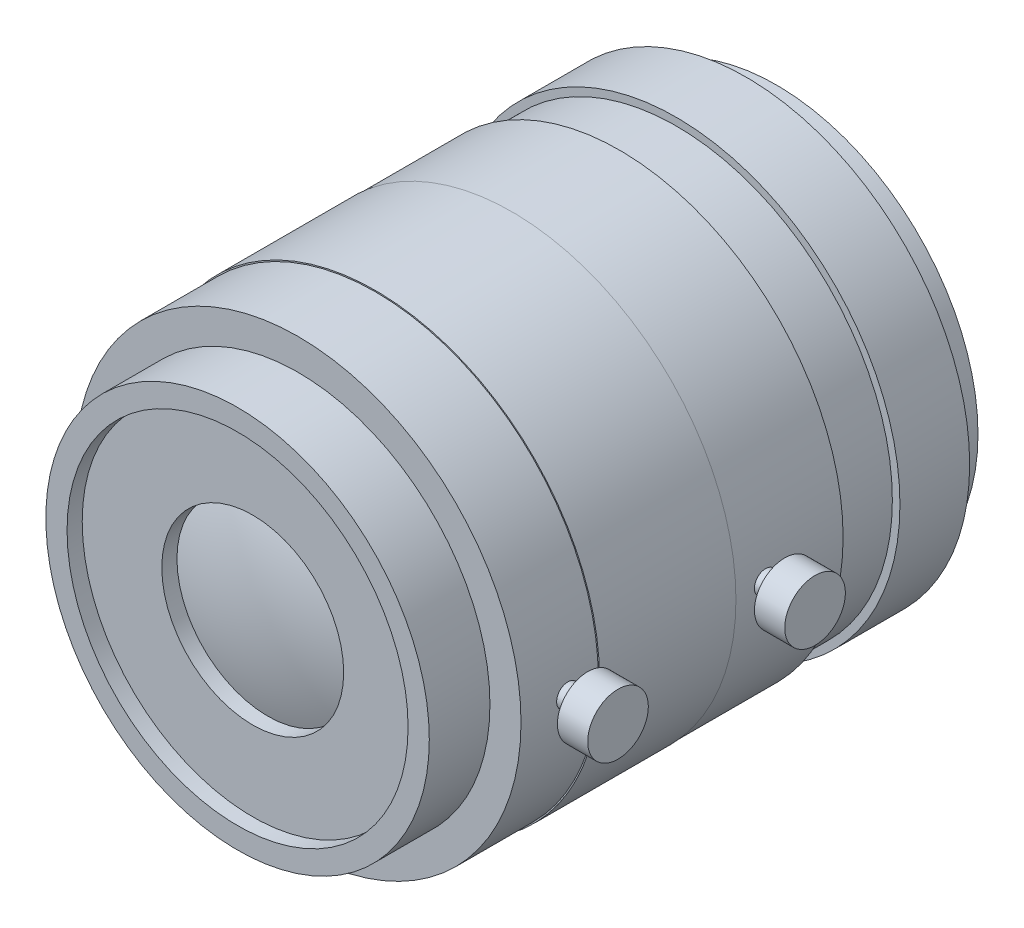
ISO-10303-21;
HEADER;
FILE_DESCRIPTION(('STEP AP214'),'2;1');
FILE_NAME('part.step','',(''),(''),'','','');
FILE_SCHEMA(('AUTOMOTIVE_DESIGN { 1 0 10303 214 1 1 1 1 }'));
ENDSEC;
DATA;
#1=APPLICATION_CONTEXT('core data for automotive mechanical design processes');
#2=APPLICATION_PROTOCOL_DEFINITION('international standard','automotive_design',2000,#1);
#3=PRODUCT_CONTEXT('',#1,'mechanical');
#4=PRODUCT('Part','Part','',(#3));
#5=PRODUCT_RELATED_PRODUCT_CATEGORY('part','',(#4));
#6=PRODUCT_DEFINITION_FORMATION('','',#4);
#7=PRODUCT_DEFINITION_CONTEXT('part definition',#1,'design');
#8=PRODUCT_DEFINITION('design','',#6,#7);
#9=PRODUCT_DEFINITION_SHAPE('','',#8);
#10=(LENGTH_UNIT() NAMED_UNIT(*) SI_UNIT(.MILLI.,.METRE.));
#11=(NAMED_UNIT(*) PLANE_ANGLE_UNIT() SI_UNIT($,.RADIAN.));
#12=(NAMED_UNIT(*) SI_UNIT($,.STERADIAN.) SOLID_ANGLE_UNIT());
#13=UNCERTAINTY_MEASURE_WITH_UNIT(LENGTH_MEASURE(1.E-05),#10,'distance_accuracy_value','');
#14=(GEOMETRIC_REPRESENTATION_CONTEXT(3) GLOBAL_UNCERTAINTY_ASSIGNED_CONTEXT((#13)) GLOBAL_UNIT_ASSIGNED_CONTEXT((#10,
#11,#12)) REPRESENTATION_CONTEXT('',''));
#15=CARTESIAN_POINT('',(0.,0.,0.));
#16=DIRECTION('',(0.,0.,1.));
#17=DIRECTION('',(1.,0.,0.));
#18=AXIS2_PLACEMENT_3D('',#15,#16,#17);
#19=CARTESIAN_POINT('',(0.,0.,17.45));
#20=DIRECTION('',(0.,0.,-1.));
#21=DIRECTION('',(-1.,0.,0.));
#22=AXIS2_PLACEMENT_3D('',#19,#20,#21);
#23=CYLINDRICAL_SURFACE('',#22,14.75);
#24=CARTESIAN_POINT('',(0.,0.,10.35));
#25=DIRECTION('',(0.,0.,1.));
#26=DIRECTION('',(1.,0.,0.));
#27=AXIS2_PLACEMENT_3D('',#24,#25,#26);
#28=CIRCLE('',#27,14.75);
#29=CARTESIAN_POINT('',(14.75,0.,10.35));
#30=VERTEX_POINT('',#29);
#31=EDGE_CURVE('E204',#30,#30,#28,.T.);
#32=ORIENTED_EDGE('',*,*,#31,.T.);
#33=EDGE_LOOP('',(#32));
#34=FACE_BOUND('',#33,.T.);
#35=CARTESIAN_POINT('',(0.,0.,17.45));
#36=DIRECTION('',(0.,0.,1.));
#37=DIRECTION('',(1.,0.,0.));
#38=AXIS2_PLACEMENT_3D('',#35,#36,#37);
#39=CIRCLE('',#38,14.75);
#40=CARTESIAN_POINT('',(14.75,0.,17.45));
#41=VERTEX_POINT('',#40);
#42=EDGE_CURVE('E201',#41,#41,#39,.T.);
#43=ORIENTED_EDGE('',*,*,#42,.F.);
#44=EDGE_LOOP('',(#43));
#45=FACE_BOUND('',#44,.T.);
#46=CARTESIAN_POINT('',(14.75,0.,16.2));
#47=CARTESIAN_POINT('',(14.7499997449926,-0.0420986424959198,16.1999981423904));
#48=CARTESIAN_POINT('',(14.7498178364062,-0.084227117100974,16.1964435033522));
#49=CARTESIAN_POINT('',(14.7491096549743,-0.167321824963212,16.1823137913616));
#50=CARTESIAN_POINT('',(14.7485829766985,-0.208286630559902,16.1717304528306));
#51=CARTESIAN_POINT('',(14.7472448652268,-0.287838272752351,16.1438471965999));
#52=CARTESIAN_POINT('',(14.7464335774809,-0.326426312178121,16.1265507091839));
#53=CARTESIAN_POINT('',(14.7446176101786,-0.400140853303471,16.0857374276205));
#54=CARTESIAN_POINT('',(14.7436129762068,-0.4352681679826,16.0622220991834));
#55=CARTESIAN_POINT('',(14.7415221582976,-0.501111084497214,16.0096114627243));
#56=CARTESIAN_POINT('',(14.7404359009587,-0.531822641295692,15.9805110947987));
#57=CARTESIAN_POINT('',(14.7383048966012,-0.587927774020349,15.9175665612008));
#58=CARTESIAN_POINT('',(14.737260151282,-0.613321132410172,15.8837222015741));
#59=CARTESIAN_POINT('',(14.7353294597504,-0.658080307671017,15.8122290397837));
#60=CARTESIAN_POINT('',(14.7344435973103,-0.677442948737445,15.7745782469103));
#61=CARTESIAN_POINT('',(14.7329314670159,-0.709570685076601,15.6965549946493));
#62=CARTESIAN_POINT('',(14.732305197142,-0.722335831681388,15.6561825564403));
#63=CARTESIAN_POINT('',(14.731383541628,-0.740895490880794,15.573899400099));
#64=CARTESIAN_POINT('',(14.7310878675586,-0.746696080050412,15.5319900558718));
#65=CARTESIAN_POINT('',(14.730859880457,-0.751180716000307,15.4477915450975));
#66=CARTESIAN_POINT('',(14.7309275644816,-0.749864820424926,15.4055023816298));
#67=CARTESIAN_POINT('',(14.7314183928722,-0.740158900928861,15.3217859763418));
#68=CARTESIAN_POINT('',(14.7318412072995,-0.731775443197582,15.2803579710477));
#69=CARTESIAN_POINT('',(14.7329941219114,-0.708182550981223,15.1994980357776));
#70=CARTESIAN_POINT('',(14.7337242234275,-0.692973086917101,15.1600661144522));
#71=CARTESIAN_POINT('',(14.7354098043382,-0.656152426913122,15.0842965251642));
#72=CARTESIAN_POINT('',(14.7363653890495,-0.63453823830094,15.0479603139455));
#73=CARTESIAN_POINT('',(14.7383941262876,-0.585523856324031,14.9794295295357));
#74=CARTESIAN_POINT('',(14.739467279674,-0.558123620652883,14.9472349866305));
#75=CARTESIAN_POINT('',(14.7416116668489,-0.498277886896576,14.8878632070561));
#76=CARTESIAN_POINT('',(14.7426828970807,-0.465826702891609,14.8606917012371));
#77=CARTESIAN_POINT('',(14.7447015288594,-0.396820222387124,14.812181458413));
#78=CARTESIAN_POINT('',(14.7456489303752,-0.360264924855566,14.7908427228748));
#79=CARTESIAN_POINT('',(14.7473131755578,-0.284084528389697,14.7546042947347));
#80=CARTESIAN_POINT('',(14.748030012027,-0.244459333668455,14.7397048031457));
#81=CARTESIAN_POINT('',(14.749152234801,-0.163265448064132,14.7167715557727));
#82=CARTESIAN_POINT('',(14.7495576235168,-0.121696772228012,14.7087377468419));
#83=CARTESIAN_POINT('',(14.750010953271,-0.0378456564079585,14.6997709807508));
#84=CARTESIAN_POINT('',(14.7500592933224,0.00443593387173076,14.6988300970024));
#85=CARTESIAN_POINT('',(14.7497941372842,0.0885563923737214,14.7040552022283));
#86=CARTESIAN_POINT('',(14.7494806424329,0.130395262110677,14.7102211668803));
#87=CARTESIAN_POINT('',(14.7485273821002,0.212420408484705,14.7294783789475));
#88=CARTESIAN_POINT('',(14.7478877871895,0.252607537222658,14.7425660060328));
#89=CARTESIAN_POINT('',(14.7463543331718,0.330214687753501,14.7752913623716));
#90=CARTESIAN_POINT('',(14.7454604725507,0.367634693067773,14.7949291306284));
#91=CARTESIAN_POINT('',(14.7435180408848,0.438681769962589,14.8402176119385));
#92=CARTESIAN_POINT('',(14.7424693334623,0.472305451480879,14.8658736372753));
#93=CARTESIAN_POINT('',(14.7403357627123,0.534771339123963,14.9224625925922));
#94=CARTESIAN_POINT('',(14.7392508991454,0.563613513578834,14.9533955575209));
#95=CARTESIAN_POINT('',(14.7371661522128,0.615724359464938,15.0196944238398));
#96=CARTESIAN_POINT('',(14.7361663475975,0.638987901484963,15.0550643597537));
#97=CARTESIAN_POINT('',(14.7343657011286,0.679246056150842,15.1292127658487));
#98=CARTESIAN_POINT('',(14.7335648583869,0.696240696776054,15.1679912208159));
#99=CARTESIAN_POINT('',(14.7322530058265,0.72346969332499,15.2478368999242));
#100=CARTESIAN_POINT('',(14.7317418559385,0.733707316723624,15.288903007397));
#101=CARTESIAN_POINT('',(14.7310666362807,0.747142356162024,15.3721738955304));
#102=CARTESIAN_POINT('',(14.7309025644511,0.75033981398336,15.4143786694318));
#103=CARTESIAN_POINT('',(14.730940053912,0.749603361923809,15.4986777958917));
#104=CARTESIAN_POINT('',(14.7311412014928,0.745677521106673,15.5407722193658));
#105=CARTESIAN_POINT('',(14.7318855848103,0.730822594702965,15.6237035035544));
#106=CARTESIAN_POINT('',(14.7324288211972,0.719893495804319,15.6645403618783));
#107=CARTESIAN_POINT('',(14.7337960620359,0.691343950804935,15.7437989630694));
#108=CARTESIAN_POINT('',(14.7346200683477,0.673723460377368,15.7822206899357));
#109=CARTESIAN_POINT('',(14.7364559527303,0.632292681526358,15.855561010223));
#110=CARTESIAN_POINT('',(14.7374678250912,0.608482581217104,15.890479710063));
#111=CARTESIAN_POINT('',(14.7395667060197,0.55531948458365,15.9558631208749));
#112=CARTESIAN_POINT('',(14.7406537903698,0.525960844517172,15.9863232402913));
#113=CARTESIAN_POINT('',(14.7427800291808,0.462538122176354,16.0418920728538));
#114=CARTESIAN_POINT('',(14.7438191717886,0.428472884478458,16.0669994680979));
#115=CARTESIAN_POINT('',(14.7457331727311,0.356576489379588,16.1111622915394));
#116=CARTESIAN_POINT('',(14.7466078699096,0.31874169278726,16.1302117955264));
#117=CARTESIAN_POINT('',(14.748092024838,0.240434606912813,16.1616653085616));
#118=CARTESIAN_POINT('',(14.7487017955551,0.19996549501561,16.174077162934));
#119=CARTESIAN_POINT('',(14.7494261963092,0.132704316154791,16.1886491975148));
#120=CARTESIAN_POINT('',(14.7496404263979,0.10634785878314,16.1929003098998));
#121=CARTESIAN_POINT('',(14.7499274089613,0.0533315922115218,16.1985762983411));
#122=CARTESIAN_POINT('',(14.7500001615611,0.026671783279859,16.2000011768969));
#123=CARTESIAN_POINT('',(14.75,0.,16.2));
#124=B_SPLINE_CURVE_WITH_KNOTS('',3,(#46,#47,#48,#49,#50,#51,#52,#53,#54,#55,#56,#57,#58,#59,
#60,#61,#62,#63,#64,#65,#66,#67,#68,#69,#70,#71,#72,#73,#74,#75,#76,#77,#78,#79,#80,#81,#82,#83,
#84,#85,#86,#87,#88,#89,#90,#91,#92,#93,#94,#95,#96,#97,#98,#99,#100,#101,#102,#103,#104,#105,
#106,#107,#108,#109,#110,#111,#112,#113,#114,#115,#116,#117,#118,#119,#120,#121,#122,#123),
.UNSPECIFIED.,.T.,.F.,(4,2,2,2,2,2,2,2,2,2,2,2,2,2,2,2,2,2,2,2,2,2,2,2,2,2,2,2,2,2,2,2,2,2,2,2,
2,2,4),(0.,0.126198565172506,0.252545800175523,0.378828559107524,0.505081581108117,
0.631449529730949,0.757822646317467,0.884262199511887,1.01070076892368,1.13702894035567,
1.26335608851653,1.38956600035197,1.51577645909641,1.64204598419815,1.76831643258942,
1.89473006730384,2.02114373380692,2.14756134625897,2.27397798011353,2.40025331805718,
2.52652822384252,2.65273714759442,2.77894682287817,2.90526832478777,3.03159066334414,
3.15802871051865,3.28446619336811,3.41084249025872,3.53721803713655,3.66345051886287,
3.78968324053764,3.91591679845009,4.04214652032955,4.16850533564246,4.29489522610437,
4.42140833997611,4.54777159020003,4.62772532642028,4.70767899192949),.UNSPECIFIED.);
#125=CARTESIAN_POINT('',(14.75,0.,16.2));
#126=VERTEX_POINT('',#125);
#127=EDGE_CURVE('E12',#126,#126,#124,.T.);
#128=ORIENTED_EDGE('',*,*,#127,.F.);
#129=EDGE_LOOP('',(#128));
#130=FACE_BOUND('',#129,.T.);
#131=ADVANCED_FACE('F47',(#34,#45,#130),#23,.T.);
#132=CARTESIAN_POINT('',(0.,0.,31.55));
#133=DIRECTION('',(0.,0.,-1.));
#134=DIRECTION('',(-1.,0.,0.));
#135=AXIS2_PLACEMENT_3D('',#132,#133,#134);
#136=CYLINDRICAL_SURFACE('',#135,14.7);
#137=CARTESIAN_POINT('',(0.,0.,26.45));
#138=DIRECTION('',(0.,0.,1.));
#139=DIRECTION('',(1.,0.,0.));
#140=AXIS2_PLACEMENT_3D('',#137,#138,#139);
#141=CIRCLE('',#140,14.7);
#142=CARTESIAN_POINT('',(14.7,0.,26.45));
#143=VERTEX_POINT('',#142);
#144=EDGE_CURVE('E215',#143,#143,#141,.T.);
#145=ORIENTED_EDGE('',*,*,#144,.T.);
#146=EDGE_LOOP('',(#145));
#147=FACE_BOUND('',#146,.T.);
#148=CARTESIAN_POINT('',(0.,0.,31.55));
#149=DIRECTION('',(0.,0.,1.));
#150=DIRECTION('',(1.,0.,0.));
#151=AXIS2_PLACEMENT_3D('',#148,#149,#150);
#152=CIRCLE('',#151,14.7);
#153=CARTESIAN_POINT('',(14.7,0.,31.55));
#154=VERTEX_POINT('',#153);
#155=EDGE_CURVE('E212',#154,#154,#152,.T.);
#156=ORIENTED_EDGE('',*,*,#155,.F.);
#157=EDGE_LOOP('',(#156));
#158=FACE_BOUND('',#157,.T.);
#159=CARTESIAN_POINT('',(14.7,0.,29.2));
#160=CARTESIAN_POINT('',(14.6999997441453,-0.0420984438103649,29.199998142467));
#161=CARTESIAN_POINT('',(14.6998172185627,-0.0842267148579676,29.196443536846));
#162=CARTESIAN_POINT('',(14.6991066351314,-0.167321007592917,29.1823139653331));
#163=CARTESIAN_POINT('',(14.6985781705394,-0.208285601837116,29.1717307352082));
#164=CARTESIAN_POINT('',(14.6972355202302,-0.287836820295201,29.1438477838122));
#165=CARTESIAN_POINT('',(14.6964214805207,-0.326424647863005,29.1265514942868));
#166=CARTESIAN_POINT('',(14.6945993514444,-0.400138807112249,29.0857386968858));
#167=CARTESIAN_POINT('',(14.6935913078001,-0.435265951459357,29.0622236541499));
#168=CARTESIAN_POINT('',(14.6914933842579,-0.501108783927412,29.0096135172327));
#169=CARTESIAN_POINT('',(14.6904034302626,-0.53182040273414,28.9805133327577));
#170=CARTESIAN_POINT('',(14.6882651688393,-0.58792570530152,28.9175691555892));
#171=CARTESIAN_POINT('',(14.6872168631168,-0.613319171466295,28.8837249688861));
#172=CARTESIAN_POINT('',(14.6852795828221,-0.658078695254236,28.8122319803044));
#173=CARTESIAN_POINT('',(14.6843906929015,-0.67744155455485,28.7745811735639));
#174=CARTESIAN_POINT('',(14.6828733906333,-0.709569710715836,28.6965578200381));
#175=CARTESIAN_POINT('',(14.6822449762488,-0.722335059169346,28.6561852945397));
#176=CARTESIAN_POINT('',(14.6813201635029,-0.740895025948526,28.5739021474881));
#177=CARTESIAN_POINT('',(14.6810234737566,-0.74669576227874,28.5319929092528));
#178=CARTESIAN_POINT('',(14.6807946928025,-0.751180720237949,28.4477945780107));
#179=CARTESIAN_POINT('',(14.6808625986258,-0.749864999816994,28.4055054881));
#180=CARTESIAN_POINT('',(14.6813550803598,-0.74015948752035,28.3217894782599));
#181=CARTESIAN_POINT('',(14.6817793229438,-0.731776306705254,28.2803617896528));
#182=CARTESIAN_POINT('',(14.682936137401,-0.708184087019952,28.1995024412166));
#183=CARTESIAN_POINT('',(14.6836687106172,-0.692975018419736,28.1600707900821));
#184=CARTESIAN_POINT('',(14.6853600039263,-0.656155206128501,28.0843015430107));
#185=CARTESIAN_POINT('',(14.6863188304115,-0.634541449501558,28.0479654136709));
#186=CARTESIAN_POINT('',(14.6883544539516,-0.585527990576816,27.9794347001342));
#187=CARTESIAN_POINT('',(14.6894312518753,-0.558128245669378,27.9472401464398));
#188=CARTESIAN_POINT('',(14.6915829353735,-0.498283286326846,27.8878679917553));
#189=CARTESIAN_POINT('',(14.6926578173612,-0.465832347166053,27.8606961606138));
#190=CARTESIAN_POINT('',(14.6946833365665,-0.396826277978345,27.8121852239036));
#191=CARTESIAN_POINT('',(14.6956339737527,-0.360271146914672,27.7908461198083));
#192=CARTESIAN_POINT('',(14.6973039102817,-0.284090975802565,27.754606924635));
#193=CARTESIAN_POINT('',(14.6980232023454,-0.244465839208952,27.7397070361539));
#194=CARTESIAN_POINT('',(14.6991492786587,-0.163271971542928,27.7167730028883));
#195=CARTESIAN_POINT('',(14.6995560653437,-0.121703255620309,27.7087388045967));
#196=CARTESIAN_POINT('',(14.7000109727551,-0.0378523005895708,27.6997713272799));
#197=CARTESIAN_POINT('',(14.7000594965732,0.00442908295278208,27.698830067767));
#198=CARTESIAN_POINT('',(14.6997934799421,0.0885491902826168,27.7040543586362));
#199=CARTESIAN_POINT('',(14.6994789407441,0.130387915595033,27.7102198845279));
#200=CARTESIAN_POINT('',(14.6985224836092,0.212412687004607,27.7294761240632));
#201=CARTESIAN_POINT('',(14.6978807379989,0.252599591024187,27.7425631925382));
#202=CARTESIAN_POINT('',(14.6963421159234,0.330206392450413,27.7752873272584));
#203=CARTESIAN_POINT('',(14.6954452379286,0.367626273265975,27.7949244327738));
#204=CARTESIAN_POINT('',(14.6934962326078,0.438673451302916,27.840211639536));
#205=CARTESIAN_POINT('',(14.692443967508,0.47229733564046,27.865867088945));
#206=CARTESIAN_POINT('',(14.6903031468177,0.534763743328181,27.9224549076625));
#207=CARTESIAN_POINT('',(14.6892145909853,0.563606234804575,27.9533873121454));
#208=CARTESIAN_POINT('',(14.6871227291205,0.615718003813322,28.019685321942));
#209=CARTESIAN_POINT('',(14.6861195026362,0.63898211688308,28.0550549894923));
#210=CARTESIAN_POINT('',(14.6843126807449,0.679241446655533,28.1292029923673));
#211=CARTESIAN_POINT('',(14.6835090844423,0.696236691480942,28.1679813123995));
#212=CARTESIAN_POINT('',(14.6821927094462,0.72346685192606,28.2478267326175));
#213=CARTESIAN_POINT('',(14.6816797892709,0.733705056820931,28.2888927086165));
#214=CARTESIAN_POINT('',(14.6810022095042,0.747141269332584,28.3721634521285));
#215=CARTESIAN_POINT('',(14.6808375478273,0.750339319104398,28.4143682128211));
#216=CARTESIAN_POINT('',(14.6808751051641,0.749604040930043,28.4986670837402));
#217=CARTESIAN_POINT('',(14.6810769062248,0.74567883709727,28.5407612652558));
#218=CARTESIAN_POINT('',(14.6818237614719,0.730825271050774,28.6236921684938));
#219=CARTESIAN_POINT('',(14.6823688163103,0.719896895532444,28.6645288878271));
#220=CARTESIAN_POINT('',(14.6837406530963,0.691348877113216,28.7437873220169));
#221=CARTESIAN_POINT('',(14.684567436868,0.673729190889461,28.7822090212354));
#222=CARTESIAN_POINT('',(14.6864095224091,0.632300081631089,28.8555494347117));
#223=CARTESIAN_POINT('',(14.6874248184603,0.60849084633696,28.8904682551737));
#224=CARTESIAN_POINT('',(14.6895308213232,0.555329300782933,28.955852339137));
#225=CARTESIAN_POINT('',(14.6906216047574,0.525971304427291,28.986312976792));
#226=CARTESIAN_POINT('',(14.6927550914892,0.462549775495414,29.0418829612071));
#227=CARTESIAN_POINT('',(14.6937977828975,0.428485087552976,29.0669909901858));
#228=CARTESIAN_POINT('',(14.6957183383228,0.356589533167721,29.1111552624439));
#229=CARTESIAN_POINT('',(14.6965960400731,0.318755014471391,29.130205560566));
#230=CARTESIAN_POINT('',(14.6980853098261,0.240448305672302,29.1616606879543));
#231=CARTESIAN_POINT('',(14.6986971918182,0.19997929282332,29.1740733616836));
#232=CARTESIAN_POINT('',(14.6994241435057,0.132715936932388,29.1886471945144));
#233=CARTESIAN_POINT('',(14.6996391398769,0.106357206840218,29.1928990561948));
#234=CARTESIAN_POINT('',(14.6999271491173,0.053336309192895,29.1985760461576));
#235=CARTESIAN_POINT('',(14.700000162113,0.0266741419080756,29.200001176958));
#236=CARTESIAN_POINT('',(14.7,0.,29.2));
#237=B_SPLINE_CURVE_WITH_KNOTS('',3,(#159,#160,#161,#162,#163,#164,#165,#166,#167,#168,#169,
#170,#171,#172,#173,#174,#175,#176,#177,#178,#179,#180,#181,#182,#183,#184,#185,#186,#187,#188,
#189,#190,#191,#192,#193,#194,#195,#196,#197,#198,#199,#200,#201,#202,#203,#204,#205,#206,#207,
#208,#209,#210,#211,#212,#213,#214,#215,#216,#217,#218,#219,#220,#221,#222,#223,#224,#225,#226,
#227,#228,#229,#230,#231,#232,#233,#234,#235,#236),.UNSPECIFIED.,.T.,.F.,(4,2,2,2,2,2,2,2,2,2,2,
2,2,2,2,2,2,2,2,2,2,2,2,2,2,2,2,2,2,2,2,2,2,2,2,2,2,2,4),(0.,0.126197960433093,
0.252544567325209,0.378826670163499,0.505079047375356,0.631447042052803,0.757820206154049,
0.88426027837824,1.01069936181455,1.13702729445477,1.26335419839501,1.3895630642709,
1.51577247985216,1.64204136221737,1.76831117449446,1.89472514972898,2.02113915689693,
2.14755714113292,2.27397414013161,2.40024888213515,2.52652318898721,2.65273106072385,
2.77893968914208,2.90526089976477,3.03158295243768,3.15802150639141,3.28445949312338,
3.41083588532728,3.53721152081273,3.66344311470057,3.78967494840356,3.91590759940786,
4.04213642198869,4.16849530592659,4.29488526286164,4.42139888087347,4.54776265052589,
4.62772345190401,4.70768418205038),.UNSPECIFIED.);
#238=CARTESIAN_POINT('',(14.7,0.,29.2));
#239=VERTEX_POINT('',#238);
#240=EDGE_CURVE('E59',#239,#239,#237,.T.);
#241=ORIENTED_EDGE('',*,*,#240,.F.);
#242=EDGE_LOOP('',(#241));
#243=FACE_BOUND('',#242,.T.);
#244=ADVANCED_FACE('F77',(#147,#158,#243),#136,.T.);
#245=CARTESIAN_POINT('',(0.,0.,31.55));
#246=DIRECTION('',(0.,0.,1.));
#247=DIRECTION('',(1.,0.,0.));
#248=AXIS2_PLACEMENT_3D('',#245,#246,#247);
#249=PLANE('',#248);
#250=ORIENTED_EDGE('',*,*,#155,.T.);
#251=EDGE_LOOP('',(#250));
#252=FACE_BOUND('',#251,.T.);
#253=CARTESIAN_POINT('',(0.,0.,31.55));
#254=DIRECTION('',(0.,0.,1.));
#255=DIRECTION('',(1.,0.,0.));
#256=AXIS2_PLACEMENT_3D('',#253,#254,#255);
#257=CIRCLE('',#256,12.65);
#258=CARTESIAN_POINT('',(12.65,0.,31.55));
#259=VERTEX_POINT('',#258);
#260=EDGE_CURVE('E220',#259,#259,#257,.T.);
#261=ORIENTED_EDGE('',*,*,#260,.F.);
#262=EDGE_LOOP('',(#261));
#263=FACE_BOUND('',#262,.T.);
#264=ADVANCED_FACE('F114',(#252,#263),#249,.T.);
#265=CARTESIAN_POINT('',(0.,0.,26.45));
#266=DIRECTION('',(0.,0.,1.));
#267=DIRECTION('',(1.,0.,0.));
#268=AXIS2_PLACEMENT_3D('',#265,#266,#267);
#269=PLANE('',#268);
#270=CARTESIAN_POINT('',(0.,0.,26.45));
#271=DIRECTION('',(0.,0.,1.));
#272=DIRECTION('',(1.,0.,0.));
#273=AXIS2_PLACEMENT_3D('',#270,#271,#272);
#274=CIRCLE('',#273,14.78);
#275=CARTESIAN_POINT('',(14.78,0.,26.45));
#276=VERTEX_POINT('',#275);
#277=EDGE_CURVE('E206',#276,#276,#274,.T.);
#278=ORIENTED_EDGE('',*,*,#277,.T.);
#279=EDGE_LOOP('',(#278));
#280=FACE_BOUND('',#279,.T.);
#281=ORIENTED_EDGE('',*,*,#144,.F.);
#282=EDGE_LOOP('',(#281));
#283=FACE_BOUND('',#282,.T.);
#284=ADVANCED_FACE('F116',(#280,#283),#269,.T.);
#285=CARTESIAN_POINT('',(0.,0.,6.6));
#286=DIRECTION('',(0.,0.,1.));
#287=DIRECTION('',(1.,0.,0.));
#288=AXIS2_PLACEMENT_3D('',#285,#286,#287);
#289=PLANE('',#288);
#290=CARTESIAN_POINT('',(0.,0.,6.6));
#291=DIRECTION('',(0.,0.,1.));
#292=DIRECTION('',(1.,0.,0.));
#293=AXIS2_PLACEMENT_3D('',#290,#291,#292);
#294=CIRCLE('',#293,14.75);
#295=CARTESIAN_POINT('',(14.75,0.,6.6));
#296=VERTEX_POINT('',#295);
#297=EDGE_CURVE('E188',#296,#296,#294,.T.);
#298=ORIENTED_EDGE('',*,*,#297,.T.);
#299=EDGE_LOOP('',(#298));
#300=FACE_BOUND('',#299,.T.);
#301=CARTESIAN_POINT('',(0.,0.,6.6));
#302=DIRECTION('',(0.,0.,1.));
#303=DIRECTION('',(1.,0.,0.));
#304=AXIS2_PLACEMENT_3D('',#301,#302,#303);
#305=CIRCLE('',#304,14.25);
#306=CARTESIAN_POINT('',(14.25,0.,6.6));
#307=VERTEX_POINT('',#306);
#308=EDGE_CURVE('E198',#307,#307,#305,.T.);
#309=ORIENTED_EDGE('',*,*,#308,.F.);
#310=EDGE_LOOP('',(#309));
#311=FACE_BOUND('',#310,.T.);
#312=ADVANCED_FACE('F122',(#300,#311),#289,.T.);
#313=CARTESIAN_POINT('',(0.,0.,0.));
#314=DIRECTION('',(0.,0.,1.));
#315=DIRECTION('',(1.,0.,0.));
#316=AXIS2_PLACEMENT_3D('',#313,#314,#315);
#317=PLANE('',#316);
#318=CARTESIAN_POINT('',(0.,0.,0.));
#319=DIRECTION('',(0.,0.,1.));
#320=DIRECTION('',(1.,0.,0.));
#321=AXIS2_PLACEMENT_3D('',#318,#319,#320);
#322=CIRCLE('',#321,13.3);
#323=CARTESIAN_POINT('',(13.3,0.,0.));
#324=VERTEX_POINT('',#323);
#325=EDGE_CURVE('E67',#324,#324,#322,.T.);
#326=ORIENTED_EDGE('',*,*,#325,.F.);
#327=EDGE_LOOP('',(#326));
#328=FACE_BOUND('',#327,.T.);
#329=CARTESIAN_POINT('',(0.,0.,0.));
#330=DIRECTION('',(0.,0.,1.));
#331=DIRECTION('',(1.,0.,0.));
#332=AXIS2_PLACEMENT_3D('',#329,#330,#331);
#333=CIRCLE('',#332,12.5);
#334=CARTESIAN_POINT('',(12.5,0.,0.));
#335=VERTEX_POINT('',#334);
#336=EDGE_CURVE('E184',#335,#335,#333,.T.);
#337=ORIENTED_EDGE('',*,*,#336,.T.);
#338=EDGE_LOOP('',(#337));
#339=FACE_BOUND('',#338,.T.);
#340=ADVANCED_FACE('F149',(#328,#339),#317,.F.);
#341=CARTESIAN_POINT('',(0.,0.,2.));
#342=DIRECTION('',(0.,0.,-1.));
#343=DIRECTION('',(-1.,0.,0.));
#344=AXIS2_PLACEMENT_3D('',#341,#342,#343);
#345=CYLINDRICAL_SURFACE('',#344,13.3);
#346=CARTESIAN_POINT('',(0.,0.,2.));
#347=DIRECTION('',(0.,0.,1.));
#348=DIRECTION('',(1.,0.,0.));
#349=AXIS2_PLACEMENT_3D('',#346,#347,#348);
#350=CIRCLE('',#349,13.3);
#351=CARTESIAN_POINT('',(13.3,0.,2.));
#352=VERTEX_POINT('',#351);
#353=EDGE_CURVE('E63',#352,#352,#350,.T.);
#354=ORIENTED_EDGE('',*,*,#353,.F.);
#355=EDGE_LOOP('',(#354));
#356=FACE_BOUND('',#355,.T.);
#357=ORIENTED_EDGE('',*,*,#325,.T.);
#358=EDGE_LOOP('',(#357));
#359=FACE_BOUND('',#358,.T.);
#360=ADVANCED_FACE('F161',(#356,#359),#345,.T.);
#361=CARTESIAN_POINT('',(0.,0.,2.));
#362=DIRECTION('',(0.,0.,-1.));
#363=DIRECTION('',(-1.,0.,0.));
#364=AXIS2_PLACEMENT_3D('',#361,#362,#363);
#365=CYLINDRICAL_SURFACE('',#364,12.5);
#366=ORIENTED_EDGE('',*,*,#336,.F.);
#367=EDGE_LOOP('',(#366));
#368=FACE_BOUND('',#367,.T.);
#369=CARTESIAN_POINT('',(0.,0.,6.6));
#370=DIRECTION('',(0.,0.,1.));
#371=DIRECTION('',(1.,0.,0.));
#372=AXIS2_PLACEMENT_3D('',#369,#370,#371);
#373=CIRCLE('',#372,12.5);
#374=CARTESIAN_POINT('',(12.5,0.,6.6));
#375=VERTEX_POINT('',#374);
#376=EDGE_CURVE('E192',#375,#375,#373,.T.);
#377=ORIENTED_EDGE('',*,*,#376,.T.);
#378=EDGE_LOOP('',(#377));
#379=FACE_BOUND('',#378,.T.);
#380=ADVANCED_FACE('F154',(#368,#379),#365,.F.);
#381=CARTESIAN_POINT('',(0.,0.,2.));
#382=DIRECTION('',(0.,0.,1.));
#383=DIRECTION('',(1.,0.,0.));
#384=AXIS2_PLACEMENT_3D('',#381,#382,#383);
#385=PLANE('',#384);
#386=CARTESIAN_POINT('',(0.,0.,2.));
#387=DIRECTION('',(0.,0.,1.));
#388=DIRECTION('',(1.,0.,0.));
#389=AXIS2_PLACEMENT_3D('',#386,#387,#388);
#390=CIRCLE('',#389,14.75);
#391=CARTESIAN_POINT('',(14.75,0.,2.));
#392=VERTEX_POINT('',#391);
#393=EDGE_CURVE('E189',#392,#392,#390,.T.);
#394=ORIENTED_EDGE('',*,*,#393,.F.);
#395=EDGE_LOOP('',(#394));
#396=FACE_BOUND('',#395,.T.);
#397=ORIENTED_EDGE('',*,*,#353,.T.);
#398=EDGE_LOOP('',(#397));
#399=FACE_BOUND('',#398,.T.);
#400=ADVANCED_FACE('F151',(#396,#399),#385,.F.);
#401=CARTESIAN_POINT('',(0.,0.,6.6));
#402=DIRECTION('',(0.,0.,-1.));
#403=DIRECTION('',(-1.,0.,0.));
#404=AXIS2_PLACEMENT_3D('',#401,#402,#403);
#405=CYLINDRICAL_SURFACE('',#404,14.75);
#406=ORIENTED_EDGE('',*,*,#297,.F.);
#407=EDGE_LOOP('',(#406));
#408=FACE_BOUND('',#407,.T.);
#409=ORIENTED_EDGE('',*,*,#393,.T.);
#410=EDGE_LOOP('',(#409));
#411=FACE_BOUND('',#410,.T.);
#412=ADVANCED_FACE('F145',(#408,#411),#405,.T.);
#413=CARTESIAN_POINT('',(0.,0.,10.35));
#414=DIRECTION('',(0.,0.,-1.));
#415=DIRECTION('',(-1.,0.,0.));
#416=AXIS2_PLACEMENT_3D('',#413,#414,#415);
#417=CYLINDRICAL_SURFACE('',#416,14.25);
#418=CARTESIAN_POINT('',(0.,0.,10.35));
#419=DIRECTION('',(0.,0.,1.));
#420=DIRECTION('',(1.,0.,0.));
#421=AXIS2_PLACEMENT_3D('',#418,#419,#420);
#422=CIRCLE('',#421,14.25);
#423=CARTESIAN_POINT('',(14.25,0.,10.35));
#424=VERTEX_POINT('',#423);
#425=EDGE_CURVE('E197',#424,#424,#422,.T.);
#426=ORIENTED_EDGE('',*,*,#425,.F.);
#427=EDGE_LOOP('',(#426));
#428=FACE_BOUND('',#427,.T.);
#429=ORIENTED_EDGE('',*,*,#308,.T.);
#430=EDGE_LOOP('',(#429));
#431=FACE_BOUND('',#430,.T.);
#432=ADVANCED_FACE('F141',(#428,#431),#417,.T.);
#433=CARTESIAN_POINT('',(0.,0.,6.6));
#434=DIRECTION('',(0.,0.,1.));
#435=DIRECTION('',(1.,0.,0.));
#436=AXIS2_PLACEMENT_3D('',#433,#434,#435);
#437=PLANE('',#436);
#438=CARTESIAN_POINT('',(0.,0.,6.6));
#439=DIRECTION('',(0.,0.,-1.));
#440=DIRECTION('',(-1.,0.,0.));
#441=AXIS2_PLACEMENT_3D('',#438,#439,#440);
#442=CIRCLE('',#441,8.875);
#443=CARTESIAN_POINT('',(-8.875,0.,6.6));
#444=VERTEX_POINT('',#443);
#445=EDGE_CURVE('E176',#444,#444,#442,.T.);
#446=ORIENTED_EDGE('',*,*,#445,.F.);
#447=EDGE_LOOP('',(#446));
#448=FACE_BOUND('',#447,.T.);
#449=ORIENTED_EDGE('',*,*,#376,.F.);
#450=EDGE_LOOP('',(#449));
#451=FACE_BOUND('',#450,.T.);
#452=ADVANCED_FACE('F138',(#448,#451),#437,.F.);
#453=CARTESIAN_POINT('',(0.,0.,10.35));
#454=DIRECTION('',(0.,0.,1.));
#455=DIRECTION('',(1.,0.,0.));
#456=AXIS2_PLACEMENT_3D('',#453,#454,#455);
#457=PLANE('',#456);
#458=ORIENTED_EDGE('',*,*,#31,.F.);
#459=EDGE_LOOP('',(#458));
#460=FACE_BOUND('',#459,.T.);
#461=ORIENTED_EDGE('',*,*,#425,.T.);
#462=EDGE_LOOP('',(#461));
#463=FACE_BOUND('',#462,.T.);
#464=ADVANCED_FACE('F136',(#460,#463),#457,.F.);
#465=CARTESIAN_POINT('',(0.,0.,17.45));
#466=DIRECTION('',(0.,0.,1.));
#467=DIRECTION('',(1.,0.,0.));
#468=AXIS2_PLACEMENT_3D('',#465,#466,#467);
#469=PLANE('',#468);
#470=CARTESIAN_POINT('',(0.,0.,17.45));
#471=DIRECTION('',(0.,0.,1.));
#472=DIRECTION('',(1.,0.,0.));
#473=AXIS2_PLACEMENT_3D('',#470,#471,#472);
#474=CIRCLE('',#473,14.78);
#475=CARTESIAN_POINT('',(14.78,0.,17.45));
#476=VERTEX_POINT('',#475);
#477=EDGE_CURVE('E209',#476,#476,#474,.T.);
#478=ORIENTED_EDGE('',*,*,#477,.F.);
#479=EDGE_LOOP('',(#478));
#480=FACE_BOUND('',#479,.T.);
#481=ORIENTED_EDGE('',*,*,#42,.T.);
#482=EDGE_LOOP('',(#481));
#483=FACE_BOUND('',#482,.T.);
#484=ADVANCED_FACE('F410',(#480,#483),#469,.F.);
#485=CARTESIAN_POINT('',(0.,0.,26.45));
#486=DIRECTION('',(0.,0.,-1.));
#487=DIRECTION('',(-1.,0.,0.));
#488=AXIS2_PLACEMENT_3D('',#485,#486,#487);
#489=CYLINDRICAL_SURFACE('',#488,14.78);
#490=ORIENTED_EDGE('',*,*,#277,.F.);
#491=EDGE_LOOP('',(#490));
#492=FACE_BOUND('',#491,.T.);
#493=ORIENTED_EDGE('',*,*,#477,.T.);
#494=EDGE_LOOP('',(#493));
#495=FACE_BOUND('',#494,.T.);
#496=ADVANCED_FACE('F112',(#492,#495),#489,.T.);
#497=CARTESIAN_POINT('',(0.,0.,35.55));
#498=DIRECTION('',(0.,0.,-1.));
#499=DIRECTION('',(-1.,0.,0.));
#500=AXIS2_PLACEMENT_3D('',#497,#498,#499);
#501=CYLINDRICAL_SURFACE('',#500,12.65);
#502=CARTESIAN_POINT('',(0.,0.,35.55));
#503=DIRECTION('',(0.,0.,1.));
#504=DIRECTION('',(1.,0.,0.));
#505=AXIS2_PLACEMENT_3D('',#502,#503,#504);
#506=CIRCLE('',#505,12.65);
#507=CARTESIAN_POINT('',(12.65,0.,35.55));
#508=VERTEX_POINT('',#507);
#509=EDGE_CURVE('E218',#508,#508,#506,.T.);
#510=ORIENTED_EDGE('',*,*,#509,.F.);
#511=EDGE_LOOP('',(#510));
#512=FACE_BOUND('',#511,.T.);
#513=ORIENTED_EDGE('',*,*,#260,.T.);
#514=EDGE_LOOP('',(#513));
#515=FACE_BOUND('',#514,.T.);
#516=ADVANCED_FACE('F109',(#512,#515),#501,.T.);
#517=CARTESIAN_POINT('',(0.,0.,35.55));
#518=DIRECTION('',(0.,0.,1.));
#519=DIRECTION('',(1.,0.,0.));
#520=AXIS2_PLACEMENT_3D('',#517,#518,#519);
#521=PLANE('',#520);
#522=CARTESIAN_POINT('',(0.,0.,35.55));
#523=DIRECTION('',(0.,0.,1.));
#524=DIRECTION('',(1.,0.,0.));
#525=AXIS2_PLACEMENT_3D('',#522,#523,#524);
#526=CIRCLE('',#525,11.25);
#527=CARTESIAN_POINT('',(11.25,0.,35.55));
#528=VERTEX_POINT('',#527);
#529=EDGE_CURVE('E175',#528,#528,#526,.T.);
#530=ORIENTED_EDGE('',*,*,#529,.F.);
#531=EDGE_LOOP('',(#530));
#532=FACE_BOUND('',#531,.T.);
#533=ORIENTED_EDGE('',*,*,#509,.T.);
#534=EDGE_LOOP('',(#533));
#535=FACE_BOUND('',#534,.T.);
#536=ADVANCED_FACE('F105',(#532,#535),#521,.T.);
#537=CARTESIAN_POINT('',(0.,0.,34.55));
#538=DIRECTION('',(0.,0.,1.));
#539=DIRECTION('',(1.,0.,0.));
#540=AXIS2_PLACEMENT_3D('',#537,#538,#539);
#541=CYLINDRICAL_SURFACE('',#540,11.25);
#542=CARTESIAN_POINT('',(0.,0.,34.55));
#543=DIRECTION('',(0.,0.,1.));
#544=DIRECTION('',(1.,0.,0.));
#545=AXIS2_PLACEMENT_3D('',#542,#543,#544);
#546=CIRCLE('',#545,11.25);
#547=CARTESIAN_POINT('',(11.25,0.,34.55));
#548=VERTEX_POINT('',#547);
#549=EDGE_CURVE('E178',#548,#548,#546,.T.);
#550=ORIENTED_EDGE('',*,*,#549,.F.);
#551=EDGE_LOOP('',(#550));
#552=FACE_BOUND('',#551,.T.);
#553=ORIENTED_EDGE('',*,*,#529,.T.);
#554=EDGE_LOOP('',(#553));
#555=FACE_BOUND('',#554,.T.);
#556=ADVANCED_FACE('F101',(#552,#555),#541,.F.);
#557=CARTESIAN_POINT('',(0.,0.,34.55));
#558=DIRECTION('',(0.,0.,1.));
#559=DIRECTION('',(1.,0.,0.));
#560=AXIS2_PLACEMENT_3D('',#557,#558,#559);
#561=PLANE('',#560);
#562=CARTESIAN_POINT('',(0.,0.,34.55));
#563=DIRECTION('',(0.,0.,1.));
#564=DIRECTION('',(1.,0.,0.));
#565=AXIS2_PLACEMENT_3D('',#562,#563,#564);
#566=CIRCLE('',#565,6.);
#567=CARTESIAN_POINT('',(6.,0.,34.55));
#568=VERTEX_POINT('',#567);
#569=EDGE_CURVE('E227',#568,#568,#566,.T.);
#570=ORIENTED_EDGE('',*,*,#569,.F.);
#571=EDGE_LOOP('',(#570));
#572=FACE_BOUND('',#571,.T.);
#573=ORIENTED_EDGE('',*,*,#549,.T.);
#574=EDGE_LOOP('',(#573));
#575=FACE_BOUND('',#574,.T.);
#576=ADVANCED_FACE('F97',(#572,#575),#561,.T.);
#577=CARTESIAN_POINT('',(0.,0.,7.6));
#578=DIRECTION('',(0.,0.,-1.));
#579=DIRECTION('',(-1.,0.,0.));
#580=AXIS2_PLACEMENT_3D('',#577,#578,#579);
#581=CYLINDRICAL_SURFACE('',#580,8.875);
#582=CARTESIAN_POINT('',(0.,0.,7.6));
#583=DIRECTION('',(0.,0.,-1.));
#584=DIRECTION('',(-1.,0.,0.));
#585=AXIS2_PLACEMENT_3D('',#582,#583,#584);
#586=CIRCLE('',#585,8.875);
#587=CARTESIAN_POINT('',(-8.875,0.,7.6));
#588=VERTEX_POINT('',#587);
#589=EDGE_CURVE('E174',#588,#588,#586,.T.);
#590=ORIENTED_EDGE('',*,*,#589,.F.);
#591=EDGE_LOOP('',(#590));
#592=FACE_BOUND('',#591,.T.);
#593=ORIENTED_EDGE('',*,*,#445,.T.);
#594=EDGE_LOOP('',(#593));
#595=FACE_BOUND('',#594,.T.);
#596=ADVANCED_FACE('F94',(#592,#595),#581,.F.);
#597=CARTESIAN_POINT('',(0.,0.,19.2276041666667));
#598=DIRECTION('',(0.,0.,1.));
#599=DIRECTION('',(1.,0.,0.));
#600=AXIS2_PLACEMENT_3D('',#597,#598,#599);
#601=SPHERICAL_SURFACE('',#600,14.6276041666667);
#602=ORIENTED_EDGE('',*,*,#589,.T.);
#603=EDGE_LOOP('',(#602));
#604=FACE_BOUND('',#603,.T.);
#605=ADVANCED_FACE('F92',(#604),#601,.T.);
#606=CARTESIAN_POINT('',(0.,0.,33.55));
#607=DIRECTION('',(0.,0.,1.));
#608=DIRECTION('',(1.,0.,0.));
#609=AXIS2_PLACEMENT_3D('',#606,#607,#608);
#610=CYLINDRICAL_SURFACE('',#609,6.);
#611=CARTESIAN_POINT('',(0.,0.,33.55));
#612=DIRECTION('',(0.,0.,1.));
#613=DIRECTION('',(1.,0.,0.));
#614=AXIS2_PLACEMENT_3D('',#611,#612,#613);
#615=CIRCLE('',#614,6.);
#616=CARTESIAN_POINT('',(6.,0.,33.55));
#617=VERTEX_POINT('',#616);
#618=EDGE_CURVE('E75',#617,#617,#615,.T.);
#619=ORIENTED_EDGE('',*,*,#618,.F.);
#620=EDGE_LOOP('',(#619));
#621=FACE_BOUND('',#620,.T.);
#622=ORIENTED_EDGE('',*,*,#569,.T.);
#623=EDGE_LOOP('',(#622));
#624=FACE_BOUND('',#623,.T.);
#625=ADVANCED_FACE('F89',(#621,#624),#610,.F.);
#626=CARTESIAN_POINT('',(0.,0.,16.05));
#627=DIRECTION('',(0.,0.,1.));
#628=DIRECTION('',(1.,0.,0.));
#629=AXIS2_PLACEMENT_3D('',#626,#627,#628);
#630=SPHERICAL_SURFACE('',#629,18.5);
#631=ORIENTED_EDGE('',*,*,#618,.T.);
#632=EDGE_LOOP('',(#631));
#633=FACE_BOUND('',#632,.T.);
#634=ADVANCED_FACE('F49',(#633),#630,.T.);
#635=CARTESIAN_POINT('',(16.,0.,28.45));
#636=DIRECTION('',(-1.,0.,0.));
#637=DIRECTION('',(0.,0.,1.));
#638=AXIS2_PLACEMENT_3D('',#635,#636,#637);
#639=CYLINDRICAL_SURFACE('',#638,0.749999999999998);
#640=CARTESIAN_POINT('',(16.,0.,28.45));
#641=DIRECTION('',(1.,0.,0.));
#642=DIRECTION('',(0.,0.,-1.));
#643=AXIS2_PLACEMENT_3D('',#640,#641,#642);
#644=CIRCLE('',#643,0.749999999999998);
#645=CARTESIAN_POINT('',(16.,0.,27.7));
#646=VERTEX_POINT('',#645);
#647=EDGE_CURVE('E230',#646,#646,#644,.T.);
#648=ORIENTED_EDGE('',*,*,#647,.F.);
#649=EDGE_LOOP('',(#648));
#650=FACE_BOUND('',#649,.T.);
#651=ORIENTED_EDGE('',*,*,#240,.T.);
#652=EDGE_LOOP('',(#651));
#653=FACE_BOUND('',#652,.T.);
#654=ADVANCED_FACE('F81',(#650,#653),#639,.T.);
#655=CARTESIAN_POINT('',(16.,0.,15.45));
#656=DIRECTION('',(-1.,0.,0.));
#657=DIRECTION('',(0.,0.,1.));
#658=AXIS2_PLACEMENT_3D('',#655,#656,#657);
#659=CYLINDRICAL_SURFACE('',#658,0.750000000000002);
#660=CARTESIAN_POINT('',(16.,0.,15.45));
#661=DIRECTION('',(1.,0.,0.));
#662=DIRECTION('',(0.,0.,-1.));
#663=AXIS2_PLACEMENT_3D('',#660,#661,#662);
#664=CIRCLE('',#663,0.750000000000002);
#665=CARTESIAN_POINT('',(16.,0.,14.7));
#666=VERTEX_POINT('',#665);
#667=EDGE_CURVE('E233',#666,#666,#664,.T.);
#668=ORIENTED_EDGE('',*,*,#667,.F.);
#669=EDGE_LOOP('',(#668));
#670=FACE_BOUND('',#669,.T.);
#671=ORIENTED_EDGE('',*,*,#127,.T.);
#672=EDGE_LOOP('',(#671));
#673=FACE_BOUND('',#672,.T.);
#674=ADVANCED_FACE('F85',(#670,#673),#659,.T.);
#675=CARTESIAN_POINT('',(16.,0.,28.45));
#676=DIRECTION('',(1.,0.,0.));
#677=DIRECTION('',(0.,0.,-1.));
#678=AXIS2_PLACEMENT_3D('',#675,#676,#677);
#679=PLANE('',#678);
#680=CARTESIAN_POINT('',(16.,0.,28.45));
#681=DIRECTION('',(1.,0.,0.));
#682=DIRECTION('',(0.,0.,-1.));
#683=AXIS2_PLACEMENT_3D('',#680,#681,#682);
#684=CIRCLE('',#683,2.);
#685=CARTESIAN_POINT('',(16.,0.,26.45));
#686=VERTEX_POINT('',#685);
#687=EDGE_CURVE('E237',#686,#686,#684,.T.);
#688=ORIENTED_EDGE('',*,*,#687,.F.);
#689=EDGE_LOOP('',(#688));
#690=FACE_BOUND('',#689,.T.);
#691=ORIENTED_EDGE('',*,*,#647,.T.);
#692=EDGE_LOOP('',(#691));
#693=FACE_BOUND('',#692,.T.);
#694=ADVANCED_FACE('F265',(#690,#693),#679,.F.);
#695=CARTESIAN_POINT('',(18.,0.,28.45));
#696=DIRECTION('',(-1.,0.,0.));
#697=DIRECTION('',(0.,0.,1.));
#698=AXIS2_PLACEMENT_3D('',#695,#696,#697);
#699=CYLINDRICAL_SURFACE('',#698,2.);
#700=CARTESIAN_POINT('',(18.,0.,28.45));
#701=DIRECTION('',(1.,0.,0.));
#702=DIRECTION('',(0.,0.,-1.));
#703=AXIS2_PLACEMENT_3D('',#700,#701,#702);
#704=CIRCLE('',#703,2.);
#705=CARTESIAN_POINT('',(18.,0.,26.45));
#706=VERTEX_POINT('',#705);
#707=EDGE_CURVE('E236',#706,#706,#704,.T.);
#708=ORIENTED_EDGE('',*,*,#707,.F.);
#709=EDGE_LOOP('',(#708));
#710=FACE_BOUND('',#709,.T.);
#711=ORIENTED_EDGE('',*,*,#687,.T.);
#712=EDGE_LOOP('',(#711));
#713=FACE_BOUND('',#712,.T.);
#714=ADVANCED_FACE('F269',(#710,#713),#699,.T.);
#715=CARTESIAN_POINT('',(18.,0.,28.45));
#716=DIRECTION('',(1.,0.,0.));
#717=DIRECTION('',(0.,0.,-1.));
#718=AXIS2_PLACEMENT_3D('',#715,#716,#717);
#719=PLANE('',#718);
#720=ORIENTED_EDGE('',*,*,#707,.T.);
#721=EDGE_LOOP('',(#720));
#722=FACE_BOUND('',#721,.T.);
#723=ADVANCED_FACE('F260',(#722),#719,.T.);
#724=CARTESIAN_POINT('',(16.,0.,15.45));
#725=DIRECTION('',(1.,0.,0.));
#726=DIRECTION('',(0.,0.,-1.));
#727=AXIS2_PLACEMENT_3D('',#724,#725,#726);
#728=PLANE('',#727);
#729=CARTESIAN_POINT('',(16.,0.,15.45));
#730=DIRECTION('',(1.,0.,0.));
#731=DIRECTION('',(0.,0.,-1.));
#732=AXIS2_PLACEMENT_3D('',#729,#730,#731);
#733=CIRCLE('',#732,2.);
#734=CARTESIAN_POINT('',(16.,0.,13.45));
#735=VERTEX_POINT('',#734);
#736=EDGE_CURVE('E243',#735,#735,#733,.T.);
#737=ORIENTED_EDGE('',*,*,#736,.F.);
#738=EDGE_LOOP('',(#737));
#739=FACE_BOUND('',#738,.T.);
#740=ORIENTED_EDGE('',*,*,#667,.T.);
#741=EDGE_LOOP('',(#740));
#742=FACE_BOUND('',#741,.T.);
#743=ADVANCED_FACE('F254',(#739,#742),#728,.F.);
#744=CARTESIAN_POINT('',(18.,0.,15.45));
#745=DIRECTION('',(-1.,0.,0.));
#746=DIRECTION('',(0.,0.,1.));
#747=AXIS2_PLACEMENT_3D('',#744,#745,#746);
#748=CYLINDRICAL_SURFACE('',#747,2.);
#749=CARTESIAN_POINT('',(18.,0.,15.45));
#750=DIRECTION('',(1.,0.,0.));
#751=DIRECTION('',(0.,0.,-1.));
#752=AXIS2_PLACEMENT_3D('',#749,#750,#751);
#753=CIRCLE('',#752,2.);
#754=CARTESIAN_POINT('',(18.,0.,13.45));
#755=VERTEX_POINT('',#754);
#756=EDGE_CURVE('E240',#755,#755,#753,.T.);
#757=ORIENTED_EDGE('',*,*,#756,.F.);
#758=EDGE_LOOP('',(#757));
#759=FACE_BOUND('',#758,.T.);
#760=ORIENTED_EDGE('',*,*,#736,.T.);
#761=EDGE_LOOP('',(#760));
#762=FACE_BOUND('',#761,.T.);
#763=ADVANCED_FACE('F251',(#759,#762),#748,.T.);
#764=CARTESIAN_POINT('',(18.,0.,15.45));
#765=DIRECTION('',(1.,0.,0.));
#766=DIRECTION('',(0.,0.,-1.));
#767=AXIS2_PLACEMENT_3D('',#764,#765,#766);
#768=PLANE('',#767);
#769=ORIENTED_EDGE('',*,*,#756,.T.);
#770=EDGE_LOOP('',(#769));
#771=FACE_BOUND('',#770,.T.);
#772=ADVANCED_FACE('F249',(#771),#768,.T.);
#773=CLOSED_SHELL('',(#131,#244,#264,#284,#312,#340,#360,#380,#400,#412,#432,#452,#464,#484,
#496,#516,#536,#556,#576,#596,#605,#625,#634,#654,#674,#694,#714,#723,#743,#763,#772));
#774=MANIFOLD_SOLID_BREP('B2',#773);
#775=ADVANCED_BREP_SHAPE_REPRESENTATION('',(#18,#774),#14);
#776=SHAPE_DEFINITION_REPRESENTATION(#9,#775);
ENDSEC;
END-ISO-10303-21;
